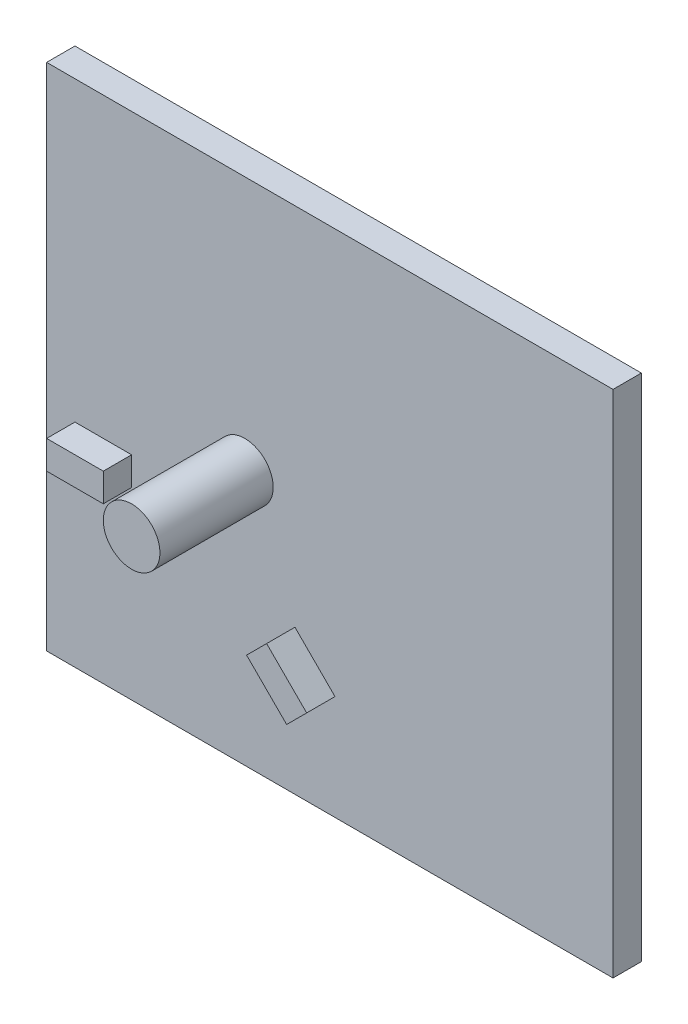
ISO-10303-21;
HEADER;
FILE_DESCRIPTION(('STEP AP214'),'2;1');
FILE_NAME('part.step','',(''),(''),'','','');
FILE_SCHEMA(('AUTOMOTIVE_DESIGN { 1 0 10303 214 1 1 1 1 }'));
ENDSEC;
DATA;
#1=APPLICATION_CONTEXT('core data for automotive mechanical design processes');
#2=APPLICATION_PROTOCOL_DEFINITION('international standard','automotive_design',2000,#1);
#3=PRODUCT_CONTEXT('',#1,'mechanical');
#4=PRODUCT('Part','Part','',(#3));
#5=PRODUCT_RELATED_PRODUCT_CATEGORY('part','',(#4));
#6=PRODUCT_DEFINITION_FORMATION('','',#4);
#7=PRODUCT_DEFINITION_CONTEXT('part definition',#1,'design');
#8=PRODUCT_DEFINITION('design','',#6,#7);
#9=PRODUCT_DEFINITION_SHAPE('','',#8);
#10=(LENGTH_UNIT() NAMED_UNIT(*) SI_UNIT(.MILLI.,.METRE.));
#11=(NAMED_UNIT(*) PLANE_ANGLE_UNIT() SI_UNIT($,.RADIAN.));
#12=(NAMED_UNIT(*) SI_UNIT($,.STERADIAN.) SOLID_ANGLE_UNIT());
#13=UNCERTAINTY_MEASURE_WITH_UNIT(LENGTH_MEASURE(1.E-05),#10,'distance_accuracy_value','');
#14=(GEOMETRIC_REPRESENTATION_CONTEXT(3) GLOBAL_UNCERTAINTY_ASSIGNED_CONTEXT((#13)) GLOBAL_UNIT_ASSIGNED_CONTEXT((#10,
#11,#12)) REPRESENTATION_CONTEXT('',''));
#15=CARTESIAN_POINT('',(0.,0.,0.));
#16=DIRECTION('',(0.,0.,1.));
#17=DIRECTION('',(1.,0.,0.));
#18=AXIS2_PLACEMENT_3D('',#15,#16,#17);
#19=CARTESIAN_POINT('',(-100.,-90.,10.));
#20=DIRECTION('',(0.,0.,-1.));
#21=DIRECTION('',(-1.,0.,0.));
#22=AXIS2_PLACEMENT_3D('',#19,#20,#21);
#23=PLANE('',#22);
#24=DIRECTION('',(0.,-1.,0.));
#25=VECTOR('',#24,1.);
#26=CARTESIAN_POINT('',(-90.,-25.,10.));
#27=LINE('',#26,#25);
#28=CARTESIAN_POINT('',(-90.,-15.,10.));
#29=VERTEX_POINT('',#28);
#30=CARTESIAN_POINT('',(-90.,-25.,10.));
#31=VERTEX_POINT('',#30);
#32=EDGE_CURVE('E149',#29,#31,#27,.T.);
#33=ORIENTED_EDGE('',*,*,#32,.F.);
#34=DIRECTION('',(-1.,0.,0.));
#35=VECTOR('',#34,1.);
#36=CARTESIAN_POINT('',(-70.,-15.,10.));
#37=LINE('',#36,#35);
#38=CARTESIAN_POINT('',(-70.,-15.,10.));
#39=VERTEX_POINT('',#38);
#40=EDGE_CURVE('E162',#39,#29,#37,.T.);
#41=ORIENTED_EDGE('',*,*,#40,.F.);
#42=DIRECTION('',(0.,1.,0.));
#43=VECTOR('',#42,1.);
#44=CARTESIAN_POINT('',(-70.,-25.,10.));
#45=LINE('',#44,#43);
#46=CARTESIAN_POINT('',(-70.,-25.,10.));
#47=VERTEX_POINT('',#46);
#48=EDGE_CURVE('E171',#47,#39,#45,.T.);
#49=ORIENTED_EDGE('',*,*,#48,.F.);
#50=DIRECTION('',(1.,0.,0.));
#51=VECTOR('',#50,1.);
#52=CARTESIAN_POINT('',(-70.,-25.,10.));
#53=LINE('',#52,#51);
#54=EDGE_CURVE('E152',#31,#47,#53,.T.);
#55=ORIENTED_EDGE('',*,*,#54,.F.);
#56=EDGE_LOOP('',(#33,#41,#49,#55));
#57=FACE_BOUND('',#56,.T.);
#58=DIRECTION('',(0.,-1.,0.));
#59=VECTOR('',#58,1.);
#60=CARTESIAN_POINT('',(-100.,90.,10.));
#61=LINE('',#60,#59);
#62=CARTESIAN_POINT('',(-100.,90.,10.));
#63=VERTEX_POINT('',#62);
#64=CARTESIAN_POINT('',(-100.,-90.,10.));
#65=VERTEX_POINT('',#64);
#66=EDGE_CURVE('E193',#63,#65,#61,.T.);
#67=ORIENTED_EDGE('',*,*,#66,.T.);
#68=DIRECTION('',(1.,0.,0.));
#69=VECTOR('',#68,1.);
#70=CARTESIAN_POINT('',(100.,-90.,10.));
#71=LINE('',#70,#69);
#72=CARTESIAN_POINT('',(100.,-90.,10.));
#73=VERTEX_POINT('',#72);
#74=EDGE_CURVE('E198',#65,#73,#71,.T.);
#75=ORIENTED_EDGE('',*,*,#74,.T.);
#76=DIRECTION('',(0.,1.,0.));
#77=VECTOR('',#76,1.);
#78=CARTESIAN_POINT('',(100.,90.,10.));
#79=LINE('',#78,#77);
#80=CARTESIAN_POINT('',(100.,90.,10.));
#81=VERTEX_POINT('',#80);
#82=EDGE_CURVE('E201',#73,#81,#79,.T.);
#83=ORIENTED_EDGE('',*,*,#82,.T.);
#84=DIRECTION('',(-1.,0.,0.));
#85=VECTOR('',#84,1.);
#86=CARTESIAN_POINT('',(100.,90.,10.));
#87=LINE('',#86,#85);
#88=EDGE_CURVE('E203',#81,#63,#87,.T.);
#89=ORIENTED_EDGE('',*,*,#88,.T.);
#90=EDGE_LOOP('',(#67,#75,#83,#89));
#91=FACE_BOUND('',#90,.T.);
#92=CARTESIAN_POINT('',(-30.,0.,10.));
#93=DIRECTION('',(0.,0.,1.));
#94=DIRECTION('',(1.,0.,0.));
#95=AXIS2_PLACEMENT_3D('',#92,#93,#94);
#96=CIRCLE('',#95,10.);
#97=CARTESIAN_POINT('',(-20.,0.,10.));
#98=VERTEX_POINT('',#97);
#99=EDGE_CURVE('E190',#98,#98,#96,.T.);
#100=ORIENTED_EDGE('',*,*,#99,.F.);
#101=EDGE_LOOP('',(#100));
#102=FACE_BOUND('',#101,.T.);
#103=DIRECTION('',(-0.707106781186543,-0.707106781186552,0.));
#104=VECTOR('',#103,1.);
#105=CARTESIAN_POINT('',(-12.3223304703361,-38.89087296526,10.));
#106=LINE('',#105,#104);
#107=CARTESIAN_POINT('',(-12.3223304703361,-38.89087296526,10.));
#108=VERTEX_POINT('',#107);
#109=CARTESIAN_POINT('',(-19.3933982822015,-45.9619407771255,10.));
#110=VERTEX_POINT('',#109);
#111=EDGE_CURVE('E148',#108,#110,#106,.T.);
#112=ORIENTED_EDGE('',*,*,#111,.F.);
#113=DIRECTION('',(-0.707106781186551,0.707106781186544,0.));
#114=VECTOR('',#113,1.);
#115=CARTESIAN_POINT('',(-12.3223304703361,-38.89087296526,10.));
#116=LINE('',#115,#114);
#117=CARTESIAN_POINT('',(1.81980515339494,-53.0330085889909,10.));
#118=VERTEX_POINT('',#117);
#119=EDGE_CURVE('E145',#118,#108,#116,.T.);
#120=ORIENTED_EDGE('',*,*,#119,.F.);
#121=DIRECTION('',(0.707106781186543,0.707106781186551,0.));
#122=VECTOR('',#121,1.);
#123=CARTESIAN_POINT('',(1.81980515339495,-53.0330085889909,10.));
#124=LINE('',#123,#122);
#125=CARTESIAN_POINT('',(-5.25126265847048,-60.1040764008564,10.));
#126=VERTEX_POINT('',#125);
#127=EDGE_CURVE('E59',#126,#118,#124,.T.);
#128=ORIENTED_EDGE('',*,*,#127,.F.);
#129=DIRECTION('',(0.707106781186551,-0.707106781186544,0.));
#130=VECTOR('',#129,1.);
#131=CARTESIAN_POINT('',(-19.3933982822015,-45.9619407771255,10.));
#132=LINE('',#131,#130);
#133=EDGE_CURVE('E54',#110,#126,#132,.T.);
#134=ORIENTED_EDGE('',*,*,#133,.F.);
#135=EDGE_LOOP('',(#112,#120,#128,#134));
#136=FACE_BOUND('',#135,.T.);
#137=ADVANCED_FACE('F39',(#57,#91,#102,#136),#23,.F.);
#138=CARTESIAN_POINT('',(-100.,-90.,0.));
#139=DIRECTION('',(0.,0.,-1.));
#140=DIRECTION('',(-1.,0.,0.));
#141=AXIS2_PLACEMENT_3D('',#138,#139,#140);
#142=PLANE('',#141);
#143=DIRECTION('',(0.,-1.,0.));
#144=VECTOR('',#143,1.);
#145=CARTESIAN_POINT('',(-100.,90.,0.));
#146=LINE('',#145,#144);
#147=CARTESIAN_POINT('',(-100.,90.,0.));
#148=VERTEX_POINT('',#147);
#149=CARTESIAN_POINT('',(-100.,-90.,0.));
#150=VERTEX_POINT('',#149);
#151=EDGE_CURVE('E192',#148,#150,#146,.T.);
#152=ORIENTED_EDGE('',*,*,#151,.F.);
#153=DIRECTION('',(-1.,0.,0.));
#154=VECTOR('',#153,1.);
#155=CARTESIAN_POINT('',(100.,90.,0.));
#156=LINE('',#155,#154);
#157=CARTESIAN_POINT('',(100.,90.,0.));
#158=VERTEX_POINT('',#157);
#159=EDGE_CURVE('E199',#158,#148,#156,.T.);
#160=ORIENTED_EDGE('',*,*,#159,.F.);
#161=DIRECTION('',(0.,1.,0.));
#162=VECTOR('',#161,1.);
#163=CARTESIAN_POINT('',(100.,90.,0.));
#164=LINE('',#163,#162);
#165=CARTESIAN_POINT('',(100.,-90.,0.));
#166=VERTEX_POINT('',#165);
#167=EDGE_CURVE('E210',#166,#158,#164,.T.);
#168=ORIENTED_EDGE('',*,*,#167,.F.);
#169=DIRECTION('',(1.,0.,0.));
#170=VECTOR('',#169,1.);
#171=CARTESIAN_POINT('',(100.,-90.,0.));
#172=LINE('',#171,#170);
#173=EDGE_CURVE('E208',#150,#166,#172,.T.);
#174=ORIENTED_EDGE('',*,*,#173,.F.);
#175=EDGE_LOOP('',(#152,#160,#168,#174));
#176=FACE_BOUND('',#175,.T.);
#177=ADVANCED_FACE('F228',(#176),#142,.T.);
#178=CARTESIAN_POINT('',(-100.,90.,10.));
#179=DIRECTION('',(1.,0.,0.));
#180=DIRECTION('',(0.,1.,0.));
#181=AXIS2_PLACEMENT_3D('',#178,#179,#180);
#182=PLANE('',#181);
#183=ORIENTED_EDGE('',*,*,#151,.T.);
#184=DIRECTION('',(0.,0.,-1.));
#185=VECTOR('',#184,1.);
#186=CARTESIAN_POINT('',(-100.,-90.,10.));
#187=LINE('',#186,#185);
#188=EDGE_CURVE('E12',#65,#150,#187,.T.);
#189=ORIENTED_EDGE('',*,*,#188,.F.);
#190=ORIENTED_EDGE('',*,*,#66,.F.);
#191=DIRECTION('',(0.,0.,-1.));
#192=VECTOR('',#191,1.);
#193=CARTESIAN_POINT('',(-100.,90.,10.));
#194=LINE('',#193,#192);
#195=EDGE_CURVE('E205',#63,#148,#194,.T.);
#196=ORIENTED_EDGE('',*,*,#195,.T.);
#197=EDGE_LOOP('',(#183,#189,#190,#196));
#198=FACE_BOUND('',#197,.T.);
#199=ADVANCED_FACE('F41',(#198),#182,.F.);
#200=CARTESIAN_POINT('',(100.,-90.,10.));
#201=DIRECTION('',(0.,1.,0.));
#202=DIRECTION('',(-1.,0.,0.));
#203=AXIS2_PLACEMENT_3D('',#200,#201,#202);
#204=PLANE('',#203);
#205=ORIENTED_EDGE('',*,*,#173,.T.);
#206=DIRECTION('',(0.,0.,-1.));
#207=VECTOR('',#206,1.);
#208=CARTESIAN_POINT('',(100.,-90.,10.));
#209=LINE('',#208,#207);
#210=EDGE_CURVE('E47',#73,#166,#209,.T.);
#211=ORIENTED_EDGE('',*,*,#210,.F.);
#212=ORIENTED_EDGE('',*,*,#74,.F.);
#213=ORIENTED_EDGE('',*,*,#188,.T.);
#214=EDGE_LOOP('',(#205,#211,#212,#213));
#215=FACE_BOUND('',#214,.T.);
#216=ADVANCED_FACE('F238',(#215),#204,.F.);
#217=CARTESIAN_POINT('',(100.,90.,10.));
#218=DIRECTION('',(-1.,0.,0.));
#219=DIRECTION('',(0.,-1.,0.));
#220=AXIS2_PLACEMENT_3D('',#217,#218,#219);
#221=PLANE('',#220);
#222=ORIENTED_EDGE('',*,*,#167,.T.);
#223=DIRECTION('',(0.,0.,-1.));
#224=VECTOR('',#223,1.);
#225=CARTESIAN_POINT('',(100.,90.,10.));
#226=LINE('',#225,#224);
#227=EDGE_CURVE('E215',#81,#158,#226,.T.);
#228=ORIENTED_EDGE('',*,*,#227,.F.);
#229=ORIENTED_EDGE('',*,*,#82,.F.);
#230=ORIENTED_EDGE('',*,*,#210,.T.);
#231=EDGE_LOOP('',(#222,#228,#229,#230));
#232=FACE_BOUND('',#231,.T.);
#233=ADVANCED_FACE('F222',(#232),#221,.F.);
#234=CARTESIAN_POINT('',(100.,90.,10.));
#235=DIRECTION('',(0.,-1.,0.));
#236=DIRECTION('',(1.,0.,0.));
#237=AXIS2_PLACEMENT_3D('',#234,#235,#236);
#238=PLANE('',#237);
#239=ORIENTED_EDGE('',*,*,#159,.T.);
#240=ORIENTED_EDGE('',*,*,#195,.F.);
#241=ORIENTED_EDGE('',*,*,#88,.F.);
#242=ORIENTED_EDGE('',*,*,#227,.T.);
#243=EDGE_LOOP('',(#239,#240,#241,#242));
#244=FACE_BOUND('',#243,.T.);
#245=ADVANCED_FACE('F231',(#244),#238,.F.);
#246=CARTESIAN_POINT('',(-30.,0.,50.));
#247=DIRECTION('',(0.,0.,-1.));
#248=DIRECTION('',(-1.,0.,0.));
#249=AXIS2_PLACEMENT_3D('',#246,#247,#248);
#250=CYLINDRICAL_SURFACE('',#249,10.);
#251=CARTESIAN_POINT('',(-30.,0.,50.));
#252=DIRECTION('',(0.,0.,-1.));
#253=DIRECTION('',(-1.,0.,0.));
#254=AXIS2_PLACEMENT_3D('',#251,#252,#253);
#255=CIRCLE('',#254,10.);
#256=CARTESIAN_POINT('',(-40.,0.,50.));
#257=VERTEX_POINT('',#256);
#258=EDGE_CURVE('E187',#257,#257,#255,.T.);
#259=ORIENTED_EDGE('',*,*,#258,.T.);
#260=EDGE_LOOP('',(#259));
#261=FACE_BOUND('',#260,.T.);
#262=ORIENTED_EDGE('',*,*,#99,.T.);
#263=EDGE_LOOP('',(#262));
#264=FACE_BOUND('',#263,.T.);
#265=ADVANCED_FACE('F253',(#261,#264),#250,.T.);
#266=CARTESIAN_POINT('',(-30.,0.,50.));
#267=DIRECTION('',(0.,0.,-1.));
#268=DIRECTION('',(-1.,0.,0.));
#269=AXIS2_PLACEMENT_3D('',#266,#267,#268);
#270=PLANE('',#269);
#271=ORIENTED_EDGE('',*,*,#258,.F.);
#272=EDGE_LOOP('',(#271));
#273=FACE_BOUND('',#272,.T.);
#274=ADVANCED_FACE('F260',(#273),#270,.F.);
#275=CARTESIAN_POINT('',(-90.,-25.,20.));
#276=DIRECTION('',(1.,0.,0.));
#277=DIRECTION('',(0.,0.,-1.));
#278=AXIS2_PLACEMENT_3D('',#275,#276,#277);
#279=PLANE('',#278);
#280=ORIENTED_EDGE('',*,*,#32,.T.);
#281=DIRECTION('',(0.,0.,-1.));
#282=VECTOR('',#281,1.);
#283=CARTESIAN_POINT('',(-90.,-25.,20.));
#284=LINE('',#283,#282);
#285=CARTESIAN_POINT('',(-90.,-25.,20.));
#286=VERTEX_POINT('',#285);
#287=EDGE_CURVE('E184',#286,#31,#284,.T.);
#288=ORIENTED_EDGE('',*,*,#287,.F.);
#289=DIRECTION('',(0.,-1.,0.));
#290=VECTOR('',#289,1.);
#291=CARTESIAN_POINT('',(-90.,-25.,20.));
#292=LINE('',#291,#290);
#293=CARTESIAN_POINT('',(-90.,-15.,20.));
#294=VERTEX_POINT('',#293);
#295=EDGE_CURVE('E158',#294,#286,#292,.T.);
#296=ORIENTED_EDGE('',*,*,#295,.F.);
#297=DIRECTION('',(0.,0.,-1.));
#298=VECTOR('',#297,1.);
#299=CARTESIAN_POINT('',(-90.,-15.,20.));
#300=LINE('',#299,#298);
#301=EDGE_CURVE('E167',#294,#29,#300,.T.);
#302=ORIENTED_EDGE('',*,*,#301,.T.);
#303=EDGE_LOOP('',(#280,#288,#296,#302));
#304=FACE_BOUND('',#303,.T.);
#305=ADVANCED_FACE('F265',(#304),#279,.F.);
#306=CARTESIAN_POINT('',(-70.,-25.,20.));
#307=DIRECTION('',(0.,1.,0.));
#308=DIRECTION('',(-1.,0.,0.));
#309=AXIS2_PLACEMENT_3D('',#306,#307,#308);
#310=PLANE('',#309);
#311=ORIENTED_EDGE('',*,*,#54,.T.);
#312=DIRECTION('',(0.,0.,-1.));
#313=VECTOR('',#312,1.);
#314=CARTESIAN_POINT('',(-70.,-25.,20.));
#315=LINE('',#314,#313);
#316=CARTESIAN_POINT('',(-70.,-25.,20.));
#317=VERTEX_POINT('',#316);
#318=EDGE_CURVE('E181',#317,#47,#315,.T.);
#319=ORIENTED_EDGE('',*,*,#318,.F.);
#320=DIRECTION('',(1.,0.,0.));
#321=VECTOR('',#320,1.);
#322=CARTESIAN_POINT('',(-70.,-25.,20.));
#323=LINE('',#322,#321);
#324=EDGE_CURVE('E161',#286,#317,#323,.T.);
#325=ORIENTED_EDGE('',*,*,#324,.F.);
#326=ORIENTED_EDGE('',*,*,#287,.T.);
#327=EDGE_LOOP('',(#311,#319,#325,#326));
#328=FACE_BOUND('',#327,.T.);
#329=ADVANCED_FACE('F308',(#328),#310,.F.);
#330=CARTESIAN_POINT('',(-70.,-25.,20.));
#331=DIRECTION('',(-1.,0.,0.));
#332=DIRECTION('',(0.,-1.,0.));
#333=AXIS2_PLACEMENT_3D('',#330,#331,#332);
#334=PLANE('',#333);
#335=ORIENTED_EDGE('',*,*,#48,.T.);
#336=DIRECTION('',(0.,0.,-1.));
#337=VECTOR('',#336,1.);
#338=CARTESIAN_POINT('',(-70.,-15.,20.));
#339=LINE('',#338,#337);
#340=CARTESIAN_POINT('',(-70.,-15.,20.));
#341=VERTEX_POINT('',#340);
#342=EDGE_CURVE('E178',#341,#39,#339,.T.);
#343=ORIENTED_EDGE('',*,*,#342,.F.);
#344=DIRECTION('',(0.,1.,0.));
#345=VECTOR('',#344,1.);
#346=CARTESIAN_POINT('',(-70.,-25.,20.));
#347=LINE('',#346,#345);
#348=EDGE_CURVE('E164',#317,#341,#347,.T.);
#349=ORIENTED_EDGE('',*,*,#348,.F.);
#350=ORIENTED_EDGE('',*,*,#318,.T.);
#351=EDGE_LOOP('',(#335,#343,#349,#350));
#352=FACE_BOUND('',#351,.T.);
#353=ADVANCED_FACE('F304',(#352),#334,.F.);
#354=CARTESIAN_POINT('',(-70.,-15.,20.));
#355=DIRECTION('',(0.,-1.,0.));
#356=DIRECTION('',(1.,0.,0.));
#357=AXIS2_PLACEMENT_3D('',#354,#355,#356);
#358=PLANE('',#357);
#359=ORIENTED_EDGE('',*,*,#40,.T.);
#360=ORIENTED_EDGE('',*,*,#301,.F.);
#361=DIRECTION('',(-1.,0.,0.));
#362=VECTOR('',#361,1.);
#363=CARTESIAN_POINT('',(-70.,-15.,20.));
#364=LINE('',#363,#362);
#365=EDGE_CURVE('E166',#341,#294,#364,.T.);
#366=ORIENTED_EDGE('',*,*,#365,.F.);
#367=ORIENTED_EDGE('',*,*,#342,.T.);
#368=EDGE_LOOP('',(#359,#360,#366,#367));
#369=FACE_BOUND('',#368,.T.);
#370=ADVANCED_FACE('F300',(#369),#358,.F.);
#371=CARTESIAN_POINT('',(-90.,-15.,20.));
#372=DIRECTION('',(0.,0.,1.));
#373=DIRECTION('',(1.,0.,0.));
#374=AXIS2_PLACEMENT_3D('',#371,#372,#373);
#375=PLANE('',#374);
#376=ORIENTED_EDGE('',*,*,#295,.T.);
#377=ORIENTED_EDGE('',*,*,#324,.T.);
#378=ORIENTED_EDGE('',*,*,#348,.T.);
#379=ORIENTED_EDGE('',*,*,#365,.T.);
#380=EDGE_LOOP('',(#376,#377,#378,#379));
#381=FACE_BOUND('',#380,.T.);
#382=ADVANCED_FACE('F297',(#381),#375,.T.);
#383=CARTESIAN_POINT('',(-12.3223304703361,-38.89087296526,20.));
#384=DIRECTION('',(0.707106781186552,-0.707106781186543,0.));
#385=DIRECTION('',(0.707106781186543,0.707106781186552,0.));
#386=AXIS2_PLACEMENT_3D('',#383,#384,#385);
#387=PLANE('',#386);
#388=ORIENTED_EDGE('',*,*,#111,.T.);
#389=DIRECTION('',(0.,0.,-1.));
#390=VECTOR('',#389,1.);
#391=CARTESIAN_POINT('',(-19.3933982822015,-45.9619407771255,20.));
#392=LINE('',#391,#390);
#393=CARTESIAN_POINT('',(-19.3933982822015,-45.9619407771255,20.));
#394=VERTEX_POINT('',#393);
#395=EDGE_CURVE('E129',#394,#110,#392,.T.);
#396=ORIENTED_EDGE('',*,*,#395,.F.);
#397=DIRECTION('',(-0.707106781186543,-0.707106781186552,0.));
#398=VECTOR('',#397,1.);
#399=CARTESIAN_POINT('',(-12.3223304703361,-38.89087296526,20.));
#400=LINE('',#399,#398);
#401=CARTESIAN_POINT('',(-12.3223304703361,-38.89087296526,20.));
#402=VERTEX_POINT('',#401);
#403=EDGE_CURVE('E136',#402,#394,#400,.T.);
#404=ORIENTED_EDGE('',*,*,#403,.F.);
#405=DIRECTION('',(0.,0.,-1.));
#406=VECTOR('',#405,1.);
#407=CARTESIAN_POINT('',(-12.3223304703361,-38.89087296526,20.));
#408=LINE('',#407,#406);
#409=EDGE_CURVE('E275',#402,#108,#408,.T.);
#410=ORIENTED_EDGE('',*,*,#409,.T.);
#411=EDGE_LOOP('',(#388,#396,#404,#410));
#412=FACE_BOUND('',#411,.T.);
#413=ADVANCED_FACE('F147',(#412),#387,.F.);
#414=CARTESIAN_POINT('',(-19.3933982822015,-45.9619407771255,20.));
#415=DIRECTION('',(0.707106781186544,0.707106781186551,0.));
#416=DIRECTION('',(-0.707106781186551,0.707106781186544,0.));
#417=AXIS2_PLACEMENT_3D('',#414,#415,#416);
#418=PLANE('',#417);
#419=ORIENTED_EDGE('',*,*,#133,.T.);
#420=DIRECTION('',(0.,0.,-1.));
#421=VECTOR('',#420,1.);
#422=CARTESIAN_POINT('',(-5.25126265847049,-60.1040764008564,20.));
#423=LINE('',#422,#421);
#424=CARTESIAN_POINT('',(-5.25126265847049,-60.1040764008564,20.));
#425=VERTEX_POINT('',#424);
#426=EDGE_CURVE('E132',#425,#126,#423,.T.);
#427=ORIENTED_EDGE('',*,*,#426,.F.);
#428=DIRECTION('',(0.707106781186551,-0.707106781186544,0.));
#429=VECTOR('',#428,1.);
#430=CARTESIAN_POINT('',(-19.3933982822015,-45.9619407771255,20.));
#431=LINE('',#430,#429);
#432=EDGE_CURVE('E125',#394,#425,#431,.T.);
#433=ORIENTED_EDGE('',*,*,#432,.F.);
#434=ORIENTED_EDGE('',*,*,#395,.T.);
#435=EDGE_LOOP('',(#419,#427,#433,#434));
#436=FACE_BOUND('',#435,.T.);
#437=ADVANCED_FACE('F127',(#436),#418,.F.);
#438=CARTESIAN_POINT('',(1.81980515339495,-53.0330085889909,20.));
#439=DIRECTION('',(-0.707106781186552,0.707106781186544,0.));
#440=DIRECTION('',(-0.707106781186544,-0.707106781186552,0.));
#441=AXIS2_PLACEMENT_3D('',#438,#439,#440);
#442=PLANE('',#441);
#443=ORIENTED_EDGE('',*,*,#127,.T.);
#444=DIRECTION('',(0.,0.,-1.));
#445=VECTOR('',#444,1.);
#446=CARTESIAN_POINT('',(1.81980515339495,-53.0330085889909,20.));
#447=LINE('',#446,#445);
#448=CARTESIAN_POINT('',(1.81980515339495,-53.0330085889909,20.));
#449=VERTEX_POINT('',#448);
#450=EDGE_CURVE('E154',#449,#118,#447,.T.);
#451=ORIENTED_EDGE('',*,*,#450,.F.);
#452=DIRECTION('',(0.707106781186543,0.707106781186551,0.));
#453=VECTOR('',#452,1.);
#454=CARTESIAN_POINT('',(1.81980515339495,-53.0330085889909,20.));
#455=LINE('',#454,#453);
#456=EDGE_CURVE('E135',#425,#449,#455,.T.);
#457=ORIENTED_EDGE('',*,*,#456,.F.);
#458=ORIENTED_EDGE('',*,*,#426,.T.);
#459=EDGE_LOOP('',(#443,#451,#457,#458));
#460=FACE_BOUND('',#459,.T.);
#461=ADVANCED_FACE('F284',(#460),#442,.F.);
#462=CARTESIAN_POINT('',(-12.3223304703361,-38.89087296526,20.));
#463=DIRECTION('',(-0.707106781186544,-0.707106781186551,0.));
#464=DIRECTION('',(0.707106781186551,-0.707106781186544,0.));
#465=AXIS2_PLACEMENT_3D('',#462,#463,#464);
#466=PLANE('',#465);
#467=ORIENTED_EDGE('',*,*,#119,.T.);
#468=ORIENTED_EDGE('',*,*,#409,.F.);
#469=DIRECTION('',(-0.707106781186551,0.707106781186544,0.));
#470=VECTOR('',#469,1.);
#471=CARTESIAN_POINT('',(-12.3223304703361,-38.89087296526,20.));
#472=LINE('',#471,#470);
#473=EDGE_CURVE('E141',#449,#402,#472,.T.);
#474=ORIENTED_EDGE('',*,*,#473,.F.);
#475=ORIENTED_EDGE('',*,*,#450,.T.);
#476=EDGE_LOOP('',(#467,#468,#474,#475));
#477=FACE_BOUND('',#476,.T.);
#478=ADVANCED_FACE('F274',(#477),#466,.F.);
#479=CARTESIAN_POINT('',(-19.3933982822015,-45.9619407771255,20.));
#480=DIRECTION('',(0.,0.,1.));
#481=DIRECTION('',(1.,0.,0.));
#482=AXIS2_PLACEMENT_3D('',#479,#480,#481);
#483=PLANE('',#482);
#484=ORIENTED_EDGE('',*,*,#403,.T.);
#485=ORIENTED_EDGE('',*,*,#432,.T.);
#486=ORIENTED_EDGE('',*,*,#456,.T.);
#487=ORIENTED_EDGE('',*,*,#473,.T.);
#488=EDGE_LOOP('',(#484,#485,#486,#487));
#489=FACE_BOUND('',#488,.T.);
#490=ADVANCED_FACE('F139',(#489),#483,.T.);
#491=CLOSED_SHELL('',(#137,#177,#199,#216,#233,#245,#265,#274,#305,#329,#353,#370,#382,#413,
#437,#461,#478,#490));
#492=MANIFOLD_SOLID_BREP('B2',#491);
#493=ADVANCED_BREP_SHAPE_REPRESENTATION('',(#18,#492),#14);
#494=SHAPE_DEFINITION_REPRESENTATION(#9,#493);
ENDSEC;
END-ISO-10303-21;
